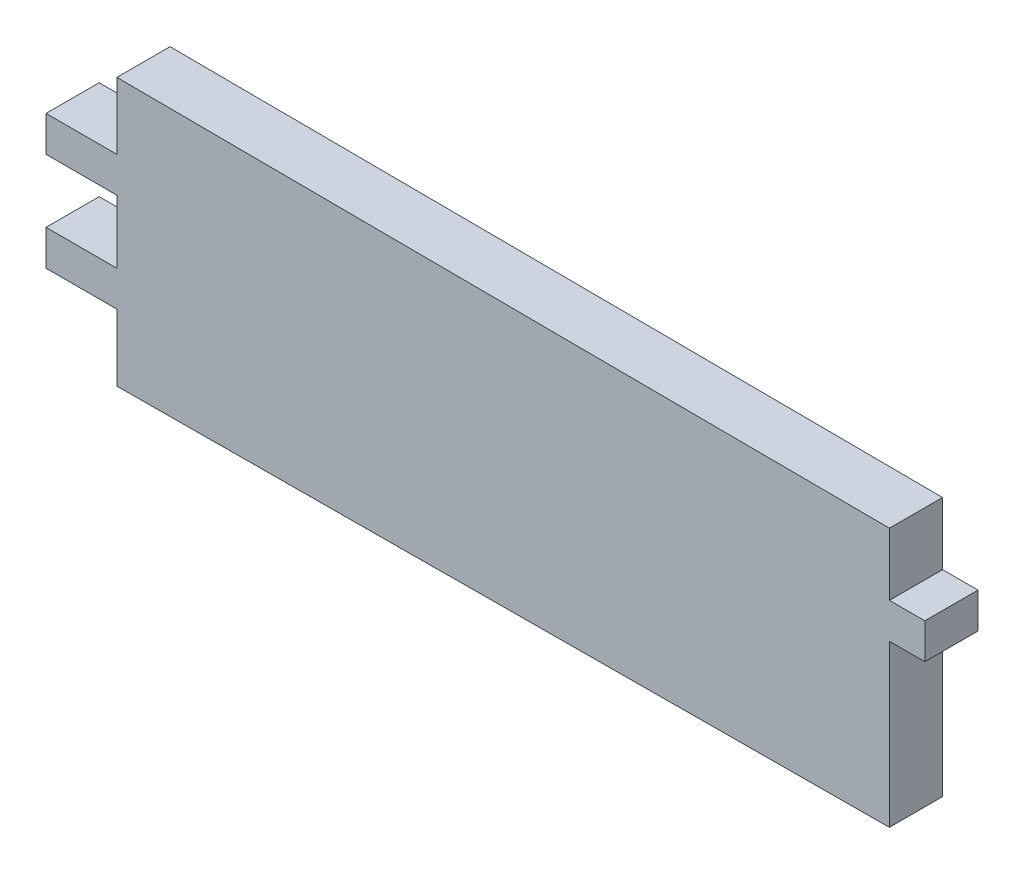
ISO-10303-21;
HEADER;
FILE_DESCRIPTION(('STEP AP214'),'2;1');
FILE_NAME('part.step','',(''),(''),'','','');
FILE_SCHEMA(('AUTOMOTIVE_DESIGN { 1 0 10303 214 1 1 1 1 }'));
ENDSEC;
DATA;
#1=APPLICATION_CONTEXT('core data for automotive mechanical design processes');
#2=APPLICATION_PROTOCOL_DEFINITION('international standard','automotive_design',2000,#1);
#3=PRODUCT_CONTEXT('',#1,'mechanical');
#4=PRODUCT('Part','Part','',(#3));
#5=PRODUCT_RELATED_PRODUCT_CATEGORY('part','',(#4));
#6=PRODUCT_DEFINITION_FORMATION('','',#4);
#7=PRODUCT_DEFINITION_CONTEXT('part definition',#1,'design');
#8=PRODUCT_DEFINITION('design','',#6,#7);
#9=PRODUCT_DEFINITION_SHAPE('','',#8);
#10=(LENGTH_UNIT() NAMED_UNIT(*) SI_UNIT(.MILLI.,.METRE.));
#11=(NAMED_UNIT(*) PLANE_ANGLE_UNIT() SI_UNIT($,.RADIAN.));
#12=(NAMED_UNIT(*) SI_UNIT($,.STERADIAN.) SOLID_ANGLE_UNIT());
#13=UNCERTAINTY_MEASURE_WITH_UNIT(LENGTH_MEASURE(1.E-05),#10,'distance_accuracy_value','');
#14=(GEOMETRIC_REPRESENTATION_CONTEXT(3) GLOBAL_UNCERTAINTY_ASSIGNED_CONTEXT((#13)) GLOBAL_UNIT_ASSIGNED_CONTEXT((#10,
#11,#12)) REPRESENTATION_CONTEXT('',''));
#15=CARTESIAN_POINT('',(0.,0.,0.));
#16=DIRECTION('',(0.,0.,1.));
#17=DIRECTION('',(1.,0.,0.));
#18=AXIS2_PLACEMENT_3D('',#15,#16,#17);
#19=CARTESIAN_POINT('',(-75.8403585971838,8.2797963886862,87.0671751823606));
#20=DIRECTION('',(1.,0.,0.));
#21=DIRECTION('',(0.,0.,-1.));
#22=AXIS2_PLACEMENT_3D('',#19,#20,#21);
#23=PLANE('',#22);
#24=DIRECTION('',(0.,-1.,0.));
#25=VECTOR('',#24,1.);
#26=CARTESIAN_POINT('',(-75.8403585971838,8.2797963886862,4.7625));
#27=LINE('',#26,#25);
#28=CARTESIAN_POINT('',(-75.8403585971838,8.2797963886862,4.7625));
#29=VERTEX_POINT('',#28);
#30=CARTESIAN_POINT('',(-75.8403585971838,5.1047963886862,4.7625));
#31=VERTEX_POINT('',#30);
#32=EDGE_CURVE('E203',#29,#31,#27,.T.);
#33=ORIENTED_EDGE('',*,*,#32,.F.);
#34=DIRECTION('',(0.,0.,-1.));
#35=VECTOR('',#34,1.);
#36=CARTESIAN_POINT('',(-75.8403585971838,8.2797963886862,87.0671751823606));
#37=LINE('',#36,#35);
#38=CARTESIAN_POINT('',(-75.8403585971838,8.2797963886862,0.));
#39=VERTEX_POINT('',#38);
#40=EDGE_CURVE('E36',#29,#39,#37,.T.);
#41=ORIENTED_EDGE('',*,*,#40,.T.);
#42=DIRECTION('',(0.,-1.,0.));
#43=VECTOR('',#42,1.);
#44=CARTESIAN_POINT('',(-75.8403585971838,8.2797963886862,0.));
#45=LINE('',#44,#43);
#46=CARTESIAN_POINT('',(-75.8403585971838,5.1047963886862,0.));
#47=VERTEX_POINT('',#46);
#48=EDGE_CURVE('E211',#39,#47,#45,.T.);
#49=ORIENTED_EDGE('',*,*,#48,.T.);
#50=DIRECTION('',(0.,0.,-1.));
#51=VECTOR('',#50,1.);
#52=CARTESIAN_POINT('',(-75.8403585971838,5.1047963886862,87.0671751823606));
#53=LINE('',#52,#51);
#54=EDGE_CURVE('E119',#31,#47,#53,.T.);
#55=ORIENTED_EDGE('',*,*,#54,.F.);
#56=EDGE_LOOP('',(#33,#41,#49,#55));
#57=FACE_BOUND('',#56,.T.);
#58=ADVANCED_FACE('F32',(#57),#23,.F.);
#59=CARTESIAN_POINT('',(-75.8403585971838,5.1047963886862,87.0671751823606));
#60=DIRECTION('',(0.,1.,0.));
#61=DIRECTION('',(-1.,0.,0.));
#62=AXIS2_PLACEMENT_3D('',#59,#60,#61);
#63=PLANE('',#62);
#64=DIRECTION('',(1.,0.,0.));
#65=VECTOR('',#64,1.);
#66=CARTESIAN_POINT('',(-75.8403585971838,5.1047963886862,4.7625));
#67=LINE('',#66,#65);
#68=CARTESIAN_POINT('',(-69.4903585971838,5.1047963886862,4.7625));
#69=VERTEX_POINT('',#68);
#70=EDGE_CURVE('E126',#31,#69,#67,.T.);
#71=ORIENTED_EDGE('',*,*,#70,.F.);
#72=ORIENTED_EDGE('',*,*,#54,.T.);
#73=DIRECTION('',(1.,0.,0.));
#74=VECTOR('',#73,1.);
#75=CARTESIAN_POINT('',(-75.8403585971838,5.1047963886862,0.));
#76=LINE('',#75,#74);
#77=CARTESIAN_POINT('',(-69.4903585971838,5.1047963886862,0.));
#78=VERTEX_POINT('',#77);
#79=EDGE_CURVE('E210',#47,#78,#76,.T.);
#80=ORIENTED_EDGE('',*,*,#79,.T.);
#81=DIRECTION('',(0.,0.,-1.));
#82=VECTOR('',#81,1.);
#83=CARTESIAN_POINT('',(-69.4903585971838,5.1047963886862,87.0671751823606));
#84=LINE('',#83,#82);
#85=EDGE_CURVE('E212',#69,#78,#84,.T.);
#86=ORIENTED_EDGE('',*,*,#85,.F.);
#87=EDGE_LOOP('',(#71,#72,#80,#86));
#88=FACE_BOUND('',#87,.T.);
#89=ADVANCED_FACE('F281',(#88),#63,.F.);
#90=CARTESIAN_POINT('',(-69.4903585971838,5.1047963886862,87.0671751823606));
#91=DIRECTION('',(1.,0.,0.));
#92=DIRECTION('',(0.,0.,-1.));
#93=AXIS2_PLACEMENT_3D('',#90,#91,#92);
#94=PLANE('',#93);
#95=DIRECTION('',(0.,-1.,0.));
#96=VECTOR('',#95,1.);
#97=CARTESIAN_POINT('',(-69.4903585971838,5.1047963886862,4.7625));
#98=LINE('',#97,#96);
#99=CARTESIAN_POINT('',(-69.4903585971838,-0.559403611313801,4.7625));
#100=VERTEX_POINT('',#99);
#101=EDGE_CURVE('E199',#69,#100,#98,.T.);
#102=ORIENTED_EDGE('',*,*,#101,.F.);
#103=ORIENTED_EDGE('',*,*,#85,.T.);
#104=DIRECTION('',(0.,-1.,0.));
#105=VECTOR('',#104,1.);
#106=CARTESIAN_POINT('',(-69.4903585971838,5.1047963886862,0.));
#107=LINE('',#106,#105);
#108=CARTESIAN_POINT('',(-69.4903585971838,-0.559403611313801,0.));
#109=VERTEX_POINT('',#108);
#110=EDGE_CURVE('E214',#78,#109,#107,.T.);
#111=ORIENTED_EDGE('',*,*,#110,.T.);
#112=DIRECTION('',(0.,0.,-1.));
#113=VECTOR('',#112,1.);
#114=CARTESIAN_POINT('',(-69.4903585971838,-0.559403611313801,87.0671751823606));
#115=LINE('',#114,#113);
#116=EDGE_CURVE('E215',#100,#109,#115,.T.);
#117=ORIENTED_EDGE('',*,*,#116,.F.);
#118=EDGE_LOOP('',(#102,#103,#111,#117));
#119=FACE_BOUND('',#118,.T.);
#120=ADVANCED_FACE('F284',(#119),#94,.F.);
#121=CARTESIAN_POINT('',(-69.4903585971838,-0.559403611313801,87.0671751823606));
#122=DIRECTION('',(0.,-1.,0.));
#123=DIRECTION('',(1.,0.,0.));
#124=AXIS2_PLACEMENT_3D('',#121,#122,#123);
#125=PLANE('',#124);
#126=DIRECTION('',(-1.,0.,0.));
#127=VECTOR('',#126,1.);
#128=CARTESIAN_POINT('',(-69.4903585971838,-0.559403611313801,4.7625));
#129=LINE('',#128,#127);
#130=CARTESIAN_POINT('',(-75.8403585971838,-0.559403611313802,4.7625));
#131=VERTEX_POINT('',#130);
#132=EDGE_CURVE('E196',#100,#131,#129,.T.);
#133=ORIENTED_EDGE('',*,*,#132,.F.);
#134=ORIENTED_EDGE('',*,*,#116,.T.);
#135=DIRECTION('',(-1.,0.,0.));
#136=VECTOR('',#135,1.);
#137=CARTESIAN_POINT('',(-69.4903585971838,-0.559403611313801,0.));
#138=LINE('',#137,#136);
#139=CARTESIAN_POINT('',(-75.8403585971838,-0.559403611313802,0.));
#140=VERTEX_POINT('',#139);
#141=EDGE_CURVE('E217',#109,#140,#138,.T.);
#142=ORIENTED_EDGE('',*,*,#141,.T.);
#143=DIRECTION('',(0.,0.,-1.));
#144=VECTOR('',#143,1.);
#145=CARTESIAN_POINT('',(-75.8403585971838,-0.559403611313802,87.0671751823606));
#146=LINE('',#145,#144);
#147=EDGE_CURVE('E218',#131,#140,#146,.T.);
#148=ORIENTED_EDGE('',*,*,#147,.F.);
#149=EDGE_LOOP('',(#133,#134,#142,#148));
#150=FACE_BOUND('',#149,.T.);
#151=ADVANCED_FACE('F286',(#150),#125,.F.);
#152=CARTESIAN_POINT('',(-75.8403585971838,-0.559403611313802,87.0671751823606));
#153=DIRECTION('',(1.,0.,0.));
#154=DIRECTION('',(0.,0.,-1.));
#155=AXIS2_PLACEMENT_3D('',#152,#153,#154);
#156=PLANE('',#155);
#157=DIRECTION('',(0.,-1.,0.));
#158=VECTOR('',#157,1.);
#159=CARTESIAN_POINT('',(-75.8403585971838,-0.559403611313802,4.7625));
#160=LINE('',#159,#158);
#161=CARTESIAN_POINT('',(-75.8403585971838,-3.7344036113138,4.7625));
#162=VERTEX_POINT('',#161);
#163=EDGE_CURVE('E193',#131,#162,#160,.T.);
#164=ORIENTED_EDGE('',*,*,#163,.F.);
#165=ORIENTED_EDGE('',*,*,#147,.T.);
#166=DIRECTION('',(0.,-1.,0.));
#167=VECTOR('',#166,1.);
#168=CARTESIAN_POINT('',(-75.8403585971838,-0.559403611313802,0.));
#169=LINE('',#168,#167);
#170=CARTESIAN_POINT('',(-75.8403585971838,-3.7344036113138,0.));
#171=VERTEX_POINT('',#170);
#172=EDGE_CURVE('E220',#140,#171,#169,.T.);
#173=ORIENTED_EDGE('',*,*,#172,.T.);
#174=DIRECTION('',(0.,0.,-1.));
#175=VECTOR('',#174,1.);
#176=CARTESIAN_POINT('',(-75.8403585971838,-3.7344036113138,87.0671751823606));
#177=LINE('',#176,#175);
#178=EDGE_CURVE('E221',#162,#171,#177,.T.);
#179=ORIENTED_EDGE('',*,*,#178,.F.);
#180=EDGE_LOOP('',(#164,#165,#173,#179));
#181=FACE_BOUND('',#180,.T.);
#182=ADVANCED_FACE('F290',(#181),#156,.F.);
#183=CARTESIAN_POINT('',(-75.8403585971838,-3.7344036113138,87.0671751823606));
#184=DIRECTION('',(0.,1.,0.));
#185=DIRECTION('',(-1.,0.,0.));
#186=AXIS2_PLACEMENT_3D('',#183,#184,#185);
#187=PLANE('',#186);
#188=DIRECTION('',(1.,0.,0.));
#189=VECTOR('',#188,1.);
#190=CARTESIAN_POINT('',(-75.8403585971838,-3.7344036113138,4.7625));
#191=LINE('',#190,#189);
#192=CARTESIAN_POINT('',(-69.4903585971838,-3.7344036113138,4.7625));
#193=VERTEX_POINT('',#192);
#194=EDGE_CURVE('E190',#162,#193,#191,.T.);
#195=ORIENTED_EDGE('',*,*,#194,.F.);
#196=ORIENTED_EDGE('',*,*,#178,.T.);
#197=DIRECTION('',(1.,0.,0.));
#198=VECTOR('',#197,1.);
#199=CARTESIAN_POINT('',(-75.8403585971838,-3.7344036113138,0.));
#200=LINE('',#199,#198);
#201=CARTESIAN_POINT('',(-69.4903585971838,-3.7344036113138,0.));
#202=VERTEX_POINT('',#201);
#203=EDGE_CURVE('E223',#171,#202,#200,.T.);
#204=ORIENTED_EDGE('',*,*,#203,.T.);
#205=DIRECTION('',(0.,0.,-1.));
#206=VECTOR('',#205,1.);
#207=CARTESIAN_POINT('',(-69.4903585971838,-3.7344036113138,87.0671751823606));
#208=LINE('',#207,#206);
#209=EDGE_CURVE('E224',#193,#202,#208,.T.);
#210=ORIENTED_EDGE('',*,*,#209,.F.);
#211=EDGE_LOOP('',(#195,#196,#204,#210));
#212=FACE_BOUND('',#211,.T.);
#213=ADVANCED_FACE('F295',(#212),#187,.F.);
#214=CARTESIAN_POINT('',(-69.4903585971838,-3.7344036113138,87.0671751823606));
#215=DIRECTION('',(1.,0.,0.));
#216=DIRECTION('',(0.,1.,0.));
#217=AXIS2_PLACEMENT_3D('',#214,#215,#216);
#218=PLANE('',#217);
#219=DIRECTION('',(0.,-1.,0.));
#220=VECTOR('',#219,1.);
#221=CARTESIAN_POINT('',(-69.4903585971838,-3.7344036113138,4.7625));
#222=LINE('',#221,#220);
#223=CARTESIAN_POINT('',(-69.4903585971838,-9.70718800527948,4.7625));
#224=VERTEX_POINT('',#223);
#225=EDGE_CURVE('E187',#193,#224,#222,.T.);
#226=ORIENTED_EDGE('',*,*,#225,.F.);
#227=ORIENTED_EDGE('',*,*,#209,.T.);
#228=DIRECTION('',(0.,-1.,0.));
#229=VECTOR('',#228,1.);
#230=CARTESIAN_POINT('',(-69.4903585971838,-3.7344036113138,0.));
#231=LINE('',#230,#229);
#232=CARTESIAN_POINT('',(-69.4903585971838,-9.70718800527948,0.));
#233=VERTEX_POINT('',#232);
#234=EDGE_CURVE('E226',#202,#233,#231,.T.);
#235=ORIENTED_EDGE('',*,*,#234,.T.);
#236=DIRECTION('',(0.,0.,-1.));
#237=VECTOR('',#236,1.);
#238=CARTESIAN_POINT('',(-69.4903585971838,-9.70718800527948,87.0671751823606));
#239=LINE('',#238,#237);
#240=EDGE_CURVE('E227',#224,#233,#239,.T.);
#241=ORIENTED_EDGE('',*,*,#240,.F.);
#242=EDGE_LOOP('',(#226,#227,#235,#241));
#243=FACE_BOUND('',#242,.T.);
#244=ADVANCED_FACE('F298',(#243),#218,.F.);
#245=CARTESIAN_POINT('',(-69.4903585971838,-9.70718800527948,87.0671751823606));
#246=DIRECTION('',(-0.00539968285960298,0.999985421606243,0.));
#247=DIRECTION('',(-0.999985421606243,-0.00539968285960298,0.));
#248=AXIS2_PLACEMENT_3D('',#245,#246,#247);
#249=PLANE('',#248);
#250=DIRECTION('',(0.999985421606243,0.00539968285960298,0.));
#251=VECTOR('',#250,1.);
#252=CARTESIAN_POINT('',(-69.4903585971838,-9.70718800527948,4.7625));
#253=LINE('',#252,#251);
#254=CARTESIAN_POINT('',(-0.275358597183701,-9.3334435075576,4.7625));
#255=VERTEX_POINT('',#254);
#256=EDGE_CURVE('E184',#224,#255,#253,.T.);
#257=ORIENTED_EDGE('',*,*,#256,.F.);
#258=ORIENTED_EDGE('',*,*,#240,.T.);
#259=DIRECTION('',(0.999985421606243,0.00539968285960298,0.));
#260=VECTOR('',#259,1.);
#261=CARTESIAN_POINT('',(-69.4903585971838,-9.70718800527948,0.));
#262=LINE('',#261,#260);
#263=CARTESIAN_POINT('',(-0.275358597183701,-9.3334435075576,0.));
#264=VERTEX_POINT('',#263);
#265=EDGE_CURVE('E229',#233,#264,#262,.T.);
#266=ORIENTED_EDGE('',*,*,#265,.T.);
#267=DIRECTION('',(0.,0.,-1.));
#268=VECTOR('',#267,1.);
#269=CARTESIAN_POINT('',(-0.275358597183701,-9.3334435075576,87.0671751823606));
#270=LINE('',#269,#268);
#271=EDGE_CURVE('E230',#255,#264,#270,.T.);
#272=ORIENTED_EDGE('',*,*,#271,.F.);
#273=EDGE_LOOP('',(#257,#258,#266,#272));
#274=FACE_BOUND('',#273,.T.);
#275=ADVANCED_FACE('F302',(#274),#249,.F.);
#276=CARTESIAN_POINT('',(-0.27535859718375,5.10479638868619,87.0671751823606));
#277=DIRECTION('',(-1.,0.,0.));
#278=DIRECTION('',(0.,-1.,0.));
#279=AXIS2_PLACEMENT_3D('',#276,#277,#278);
#280=PLANE('',#279);
#281=DIRECTION('',(0.,1.,0.));
#282=VECTOR('',#281,1.);
#283=CARTESIAN_POINT('',(-0.27535859718375,5.10479638868619,4.7625));
#284=LINE('',#283,#282);
#285=CARTESIAN_POINT('',(-0.27535859718375,5.10479638868619,4.7625));
#286=VERTEX_POINT('',#285);
#287=EDGE_CURVE('E181',#255,#286,#284,.T.);
#288=ORIENTED_EDGE('',*,*,#287,.F.);
#289=ORIENTED_EDGE('',*,*,#271,.T.);
#290=DIRECTION('',(0.,1.,0.));
#291=VECTOR('',#290,1.);
#292=CARTESIAN_POINT('',(-0.27535859718375,5.10479638868619,0.));
#293=LINE('',#292,#291);
#294=CARTESIAN_POINT('',(-0.27535859718375,5.10479638868619,0.));
#295=VERTEX_POINT('',#294);
#296=EDGE_CURVE('E232',#264,#295,#293,.T.);
#297=ORIENTED_EDGE('',*,*,#296,.T.);
#298=DIRECTION('',(0.,0.,-1.));
#299=VECTOR('',#298,1.);
#300=CARTESIAN_POINT('',(-0.27535859718375,5.10479638868619,87.0671751823606));
#301=LINE('',#300,#299);
#302=EDGE_CURVE('E233',#286,#295,#301,.T.);
#303=ORIENTED_EDGE('',*,*,#302,.F.);
#304=EDGE_LOOP('',(#288,#289,#297,#303));
#305=FACE_BOUND('',#304,.T.);
#306=ADVANCED_FACE('F307',(#305),#280,.F.);
#307=CARTESIAN_POINT('',(2.89964140281629,5.10479638868619,87.0671751823606));
#308=DIRECTION('',(0.,1.,0.));
#309=DIRECTION('',(0.,0.,1.));
#310=AXIS2_PLACEMENT_3D('',#307,#308,#309);
#311=PLANE('',#310);
#312=DIRECTION('',(1.,0.,0.));
#313=VECTOR('',#312,1.);
#314=CARTESIAN_POINT('',(2.89964140281629,5.10479638868619,4.7625));
#315=LINE('',#314,#313);
#316=CARTESIAN_POINT('',(2.89964140281629,5.10479638868619,4.7625));
#317=VERTEX_POINT('',#316);
#318=EDGE_CURVE('E178',#286,#317,#315,.T.);
#319=ORIENTED_EDGE('',*,*,#318,.F.);
#320=ORIENTED_EDGE('',*,*,#302,.T.);
#321=DIRECTION('',(1.,0.,0.));
#322=VECTOR('',#321,1.);
#323=CARTESIAN_POINT('',(2.89964140281629,5.10479638868619,0.));
#324=LINE('',#323,#322);
#325=CARTESIAN_POINT('',(2.89964140281629,5.10479638868619,0.));
#326=VERTEX_POINT('',#325);
#327=EDGE_CURVE('E235',#295,#326,#324,.T.);
#328=ORIENTED_EDGE('',*,*,#327,.T.);
#329=DIRECTION('',(0.,0.,-1.));
#330=VECTOR('',#329,1.);
#331=CARTESIAN_POINT('',(2.89964140281629,5.10479638868619,87.0671751823606));
#332=LINE('',#331,#330);
#333=EDGE_CURVE('E236',#317,#326,#332,.T.);
#334=ORIENTED_EDGE('',*,*,#333,.F.);
#335=EDGE_LOOP('',(#319,#320,#328,#334));
#336=FACE_BOUND('',#335,.T.);
#337=ADVANCED_FACE('F310',(#336),#311,.F.);
#338=CARTESIAN_POINT('',(2.89964140281629,8.27979638868618,87.0671751823606));
#339=DIRECTION('',(-1.,0.,0.));
#340=DIRECTION('',(0.,0.,1.));
#341=AXIS2_PLACEMENT_3D('',#338,#339,#340);
#342=PLANE('',#341);
#343=DIRECTION('',(0.,1.,0.));
#344=VECTOR('',#343,1.);
#345=CARTESIAN_POINT('',(2.89964140281629,8.27979638868618,4.7625));
#346=LINE('',#345,#344);
#347=CARTESIAN_POINT('',(2.89964140281629,8.27979638868618,4.7625));
#348=VERTEX_POINT('',#347);
#349=EDGE_CURVE('E175',#317,#348,#346,.T.);
#350=ORIENTED_EDGE('',*,*,#349,.F.);
#351=ORIENTED_EDGE('',*,*,#333,.T.);
#352=DIRECTION('',(0.,1.,0.));
#353=VECTOR('',#352,1.);
#354=CARTESIAN_POINT('',(2.89964140281629,8.27979638868618,0.));
#355=LINE('',#354,#353);
#356=CARTESIAN_POINT('',(2.89964140281629,8.27979638868618,0.));
#357=VERTEX_POINT('',#356);
#358=EDGE_CURVE('E238',#326,#357,#355,.T.);
#359=ORIENTED_EDGE('',*,*,#358,.T.);
#360=DIRECTION('',(0.,0.,-1.));
#361=VECTOR('',#360,1.);
#362=CARTESIAN_POINT('',(2.89964140281629,8.27979638868618,87.0671751823606));
#363=LINE('',#362,#361);
#364=EDGE_CURVE('E239',#348,#357,#363,.T.);
#365=ORIENTED_EDGE('',*,*,#364,.F.);
#366=EDGE_LOOP('',(#350,#351,#359,#365));
#367=FACE_BOUND('',#366,.T.);
#368=ADVANCED_FACE('F314',(#367),#342,.F.);
#369=CARTESIAN_POINT('',(-0.27535859718375,8.27979638868618,87.0671751823606));
#370=DIRECTION('',(0.,-1.,0.));
#371=DIRECTION('',(0.,0.,-1.));
#372=AXIS2_PLACEMENT_3D('',#369,#370,#371);
#373=PLANE('',#372);
#374=DIRECTION('',(-1.,0.,0.));
#375=VECTOR('',#374,1.);
#376=CARTESIAN_POINT('',(-0.27535859718375,8.27979638868618,4.7625));
#377=LINE('',#376,#375);
#378=CARTESIAN_POINT('',(-0.27535859718375,8.27979638868618,4.7625));
#379=VERTEX_POINT('',#378);
#380=EDGE_CURVE('E170',#348,#379,#377,.T.);
#381=ORIENTED_EDGE('',*,*,#380,.F.);
#382=ORIENTED_EDGE('',*,*,#364,.T.);
#383=DIRECTION('',(-1.,0.,0.));
#384=VECTOR('',#383,1.);
#385=CARTESIAN_POINT('',(-0.27535859718375,8.27979638868618,0.));
#386=LINE('',#385,#384);
#387=CARTESIAN_POINT('',(-0.27535859718375,8.27979638868618,0.));
#388=VERTEX_POINT('',#387);
#389=EDGE_CURVE('E241',#357,#388,#386,.T.);
#390=ORIENTED_EDGE('',*,*,#389,.T.);
#391=DIRECTION('',(0.,0.,-1.));
#392=VECTOR('',#391,1.);
#393=CARTESIAN_POINT('',(-0.27535859718375,8.27979638868618,87.0671751823606));
#394=LINE('',#393,#392);
#395=EDGE_CURVE('E242',#379,#388,#394,.T.);
#396=ORIENTED_EDGE('',*,*,#395,.F.);
#397=EDGE_LOOP('',(#381,#382,#390,#396));
#398=FACE_BOUND('',#397,.T.);
#399=ADVANCED_FACE('F319',(#398),#373,.F.);
#400=CARTESIAN_POINT('',(-0.27535859718375,8.27979638868618,87.0671751823606));
#401=DIRECTION('',(-1.,0.,0.));
#402=DIRECTION('',(0.,-1.,0.));
#403=AXIS2_PLACEMENT_3D('',#400,#401,#402);
#404=PLANE('',#403);
#405=DIRECTION('',(0.,1.,0.));
#406=VECTOR('',#405,1.);
#407=CARTESIAN_POINT('',(-0.27535859718375,8.27979638868618,4.7625));
#408=LINE('',#407,#406);
#409=CARTESIAN_POINT('',(-0.275358597183769,13.8788519118407,4.7625));
#410=VERTEX_POINT('',#409);
#411=EDGE_CURVE('E168',#379,#410,#408,.T.);
#412=ORIENTED_EDGE('',*,*,#411,.F.);
#413=ORIENTED_EDGE('',*,*,#395,.T.);
#414=DIRECTION('',(0.,1.,0.));
#415=VECTOR('',#414,1.);
#416=CARTESIAN_POINT('',(-0.27535859718375,8.27979638868618,0.));
#417=LINE('',#416,#415);
#418=CARTESIAN_POINT('',(-0.275358597183769,13.8788519118407,0.));
#419=VERTEX_POINT('',#418);
#420=EDGE_CURVE('E244',#388,#419,#417,.T.);
#421=ORIENTED_EDGE('',*,*,#420,.T.);
#422=DIRECTION('',(0.,0.,-1.));
#423=VECTOR('',#422,1.);
#424=CARTESIAN_POINT('',(-0.275358597183769,13.8788519118407,87.0671751823606));
#425=LINE('',#424,#423);
#426=EDGE_CURVE('E245',#410,#419,#425,.T.);
#427=ORIENTED_EDGE('',*,*,#426,.F.);
#428=EDGE_LOOP('',(#412,#413,#421,#427));
#429=FACE_BOUND('',#428,.T.);
#430=ADVANCED_FACE('F322',(#429),#404,.F.);
#431=CARTESIAN_POINT('',(-69.4903585971838,14.2526107600247,87.0671751823606));
#432=DIRECTION('',(-0.00539989018221393,-0.999985420486729,0.));
#433=DIRECTION('',(0.999985420486729,-0.00539989018221393,0.));
#434=AXIS2_PLACEMENT_3D('',#431,#432,#433);
#435=PLANE('',#434);
#436=DIRECTION('',(-0.999985420486729,0.00539989018221393,0.));
#437=VECTOR('',#436,1.);
#438=CARTESIAN_POINT('',(-69.4903585971838,14.2526107600247,4.7625));
#439=LINE('',#438,#437);
#440=CARTESIAN_POINT('',(-69.4903585971838,14.2526107600247,4.7625));
#441=VERTEX_POINT('',#440);
#442=EDGE_CURVE('E41',#410,#441,#439,.T.);
#443=ORIENTED_EDGE('',*,*,#442,.F.);
#444=ORIENTED_EDGE('',*,*,#426,.T.);
#445=DIRECTION('',(-0.999985420486729,0.00539989018221393,0.));
#446=VECTOR('',#445,1.);
#447=CARTESIAN_POINT('',(-69.4903585971838,14.2526107600247,0.));
#448=LINE('',#447,#446);
#449=CARTESIAN_POINT('',(-69.4903585971838,14.2526107600247,0.));
#450=VERTEX_POINT('',#449);
#451=EDGE_CURVE('E162',#419,#450,#448,.T.);
#452=ORIENTED_EDGE('',*,*,#451,.T.);
#453=DIRECTION('',(0.,0.,-1.));
#454=VECTOR('',#453,1.);
#455=CARTESIAN_POINT('',(-69.4903585971838,14.2526107600247,87.0671751823606));
#456=LINE('',#455,#454);
#457=EDGE_CURVE('E153',#441,#450,#456,.T.);
#458=ORIENTED_EDGE('',*,*,#457,.F.);
#459=EDGE_LOOP('',(#443,#444,#452,#458));
#460=FACE_BOUND('',#459,.T.);
#461=ADVANCED_FACE('F159',(#460),#435,.F.);
#462=CARTESIAN_POINT('',(-69.4903585971838,8.2797963886862,87.0671751823606));
#463=DIRECTION('',(1.,0.,0.));
#464=DIRECTION('',(0.,1.,0.));
#465=AXIS2_PLACEMENT_3D('',#462,#463,#464);
#466=PLANE('',#465);
#467=DIRECTION('',(0.,-1.,0.));
#468=VECTOR('',#467,1.);
#469=CARTESIAN_POINT('',(-69.4903585971838,8.2797963886862,4.7625));
#470=LINE('',#469,#468);
#471=CARTESIAN_POINT('',(-69.4903585971838,8.2797963886862,4.7625));
#472=VERTEX_POINT('',#471);
#473=EDGE_CURVE('E11',#441,#472,#470,.T.);
#474=ORIENTED_EDGE('',*,*,#473,.F.);
#475=ORIENTED_EDGE('',*,*,#457,.T.);
#476=DIRECTION('',(0.,-1.,0.));
#477=VECTOR('',#476,1.);
#478=CARTESIAN_POINT('',(-69.4903585971838,8.2797963886862,0.));
#479=LINE('',#478,#477);
#480=CARTESIAN_POINT('',(-69.4903585971838,8.2797963886862,0.));
#481=VERTEX_POINT('',#480);
#482=EDGE_CURVE('E164',#450,#481,#479,.T.);
#483=ORIENTED_EDGE('',*,*,#482,.T.);
#484=DIRECTION('',(0.,0.,-1.));
#485=VECTOR('',#484,1.);
#486=CARTESIAN_POINT('',(-69.4903585971838,8.2797963886862,87.0671751823606));
#487=LINE('',#486,#485);
#488=EDGE_CURVE('E54',#472,#481,#487,.T.);
#489=ORIENTED_EDGE('',*,*,#488,.F.);
#490=EDGE_LOOP('',(#474,#475,#483,#489));
#491=FACE_BOUND('',#490,.T.);
#492=ADVANCED_FACE('F152',(#491),#466,.F.);
#493=CARTESIAN_POINT('',(-75.8403585971838,8.2797963886862,87.0671751823606));
#494=DIRECTION('',(0.,-1.,0.));
#495=DIRECTION('',(0.,0.,-1.));
#496=AXIS2_PLACEMENT_3D('',#493,#494,#495);
#497=PLANE('',#496);
#498=DIRECTION('',(-1.,0.,0.));
#499=VECTOR('',#498,1.);
#500=CARTESIAN_POINT('',(-75.8403585971838,8.2797963886862,4.7625));
#501=LINE('',#500,#499);
#502=EDGE_CURVE('E206',#472,#29,#501,.T.);
#503=ORIENTED_EDGE('',*,*,#502,.F.);
#504=ORIENTED_EDGE('',*,*,#488,.T.);
#505=DIRECTION('',(-1.,0.,0.));
#506=VECTOR('',#505,1.);
#507=CARTESIAN_POINT('',(-75.8403585971838,8.2797963886862,0.));
#508=LINE('',#507,#506);
#509=EDGE_CURVE('E208',#481,#39,#508,.T.);
#510=ORIENTED_EDGE('',*,*,#509,.T.);
#511=ORIENTED_EDGE('',*,*,#40,.F.);
#512=EDGE_LOOP('',(#503,#504,#510,#511));
#513=FACE_BOUND('',#512,.T.);
#514=ADVANCED_FACE('F276',(#513),#497,.F.);
#515=CARTESIAN_POINT('',(0.,0.,0.));
#516=DIRECTION('',(0.,0.,1.));
#517=DIRECTION('',(1.,0.,0.));
#518=AXIS2_PLACEMENT_3D('',#515,#516,#517);
#519=PLANE('',#518);
#520=ORIENTED_EDGE('',*,*,#48,.F.);
#521=ORIENTED_EDGE('',*,*,#509,.F.);
#522=ORIENTED_EDGE('',*,*,#482,.F.);
#523=ORIENTED_EDGE('',*,*,#451,.F.);
#524=ORIENTED_EDGE('',*,*,#420,.F.);
#525=ORIENTED_EDGE('',*,*,#389,.F.);
#526=ORIENTED_EDGE('',*,*,#358,.F.);
#527=ORIENTED_EDGE('',*,*,#327,.F.);
#528=ORIENTED_EDGE('',*,*,#296,.F.);
#529=ORIENTED_EDGE('',*,*,#265,.F.);
#530=ORIENTED_EDGE('',*,*,#234,.F.);
#531=ORIENTED_EDGE('',*,*,#203,.F.);
#532=ORIENTED_EDGE('',*,*,#172,.F.);
#533=ORIENTED_EDGE('',*,*,#141,.F.);
#534=ORIENTED_EDGE('',*,*,#110,.F.);
#535=ORIENTED_EDGE('',*,*,#79,.F.);
#536=EDGE_LOOP('',(#520,#521,#522,#523,#524,#525,#526,#527,#528,#529,#530,#531,#532,#533,#534,#535));
#537=FACE_BOUND('',#536,.T.);
#538=ADVANCED_FACE('F278',(#537),#519,.F.);
#539=CARTESIAN_POINT('',(305.282450244832,8.2797963886862,4.7625));
#540=DIRECTION('',(0.,0.,1.));
#541=DIRECTION('',(1.,0.,0.));
#542=AXIS2_PLACEMENT_3D('',#539,#540,#541);
#543=PLANE('',#542);
#544=ORIENTED_EDGE('',*,*,#502,.T.);
#545=ORIENTED_EDGE('',*,*,#32,.T.);
#546=ORIENTED_EDGE('',*,*,#70,.T.);
#547=ORIENTED_EDGE('',*,*,#101,.T.);
#548=ORIENTED_EDGE('',*,*,#132,.T.);
#549=ORIENTED_EDGE('',*,*,#163,.T.);
#550=ORIENTED_EDGE('',*,*,#194,.T.);
#551=ORIENTED_EDGE('',*,*,#225,.T.);
#552=ORIENTED_EDGE('',*,*,#256,.T.);
#553=ORIENTED_EDGE('',*,*,#287,.T.);
#554=ORIENTED_EDGE('',*,*,#318,.T.);
#555=ORIENTED_EDGE('',*,*,#349,.T.);
#556=ORIENTED_EDGE('',*,*,#380,.T.);
#557=ORIENTED_EDGE('',*,*,#411,.T.);
#558=ORIENTED_EDGE('',*,*,#442,.T.);
#559=ORIENTED_EDGE('',*,*,#473,.T.);
#560=EDGE_LOOP('',(#544,#545,#546,#547,#548,#549,#550,#551,#552,#553,#554,#555,#556,#557,#558,#559));
#561=FACE_BOUND('',#560,.T.);
#562=ADVANCED_FACE('F34',(#561),#543,.T.);
#563=CLOSED_SHELL('',(#58,#89,#120,#151,#182,#213,#244,#275,#306,#337,#368,#399,#430,#461,#492,
#514,#538,#562));
#564=MANIFOLD_SOLID_BREP('B2',#563);
#565=ADVANCED_BREP_SHAPE_REPRESENTATION('',(#18,#564),#14);
#566=SHAPE_DEFINITION_REPRESENTATION(#9,#565);
ENDSEC;
END-ISO-10303-21;
